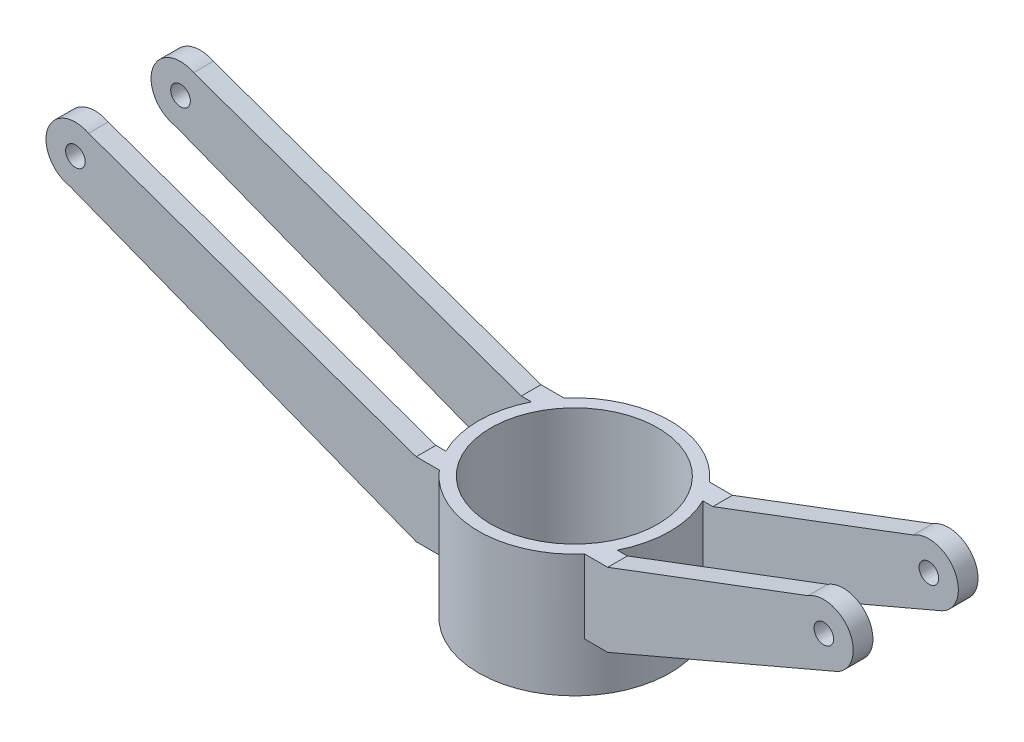
ISO-10303-21;
HEADER;
FILE_DESCRIPTION(('STEP AP214'),'2;1');
FILE_NAME('part.step','',(''),(''),'','','');
FILE_SCHEMA(('AUTOMOTIVE_DESIGN { 1 0 10303 214 1 1 1 1 }'));
ENDSEC;
DATA;
#1=APPLICATION_CONTEXT('core data for automotive mechanical design processes');
#2=APPLICATION_PROTOCOL_DEFINITION('international standard','automotive_design',2000,#1);
#3=PRODUCT_CONTEXT('',#1,'mechanical');
#4=PRODUCT('Part','Part','',(#3));
#5=PRODUCT_RELATED_PRODUCT_CATEGORY('part','',(#4));
#6=PRODUCT_DEFINITION_FORMATION('','',#4);
#7=PRODUCT_DEFINITION_CONTEXT('part definition',#1,'design');
#8=PRODUCT_DEFINITION('design','',#6,#7);
#9=PRODUCT_DEFINITION_SHAPE('','',#8);
#10=(LENGTH_UNIT() NAMED_UNIT(*) SI_UNIT(.MILLI.,.METRE.));
#11=(NAMED_UNIT(*) PLANE_ANGLE_UNIT() SI_UNIT($,.RADIAN.));
#12=(NAMED_UNIT(*) SI_UNIT($,.STERADIAN.) SOLID_ANGLE_UNIT());
#13=UNCERTAINTY_MEASURE_WITH_UNIT(LENGTH_MEASURE(1.E-05),#10,'distance_accuracy_value','');
#14=(GEOMETRIC_REPRESENTATION_CONTEXT(3) GLOBAL_UNCERTAINTY_ASSIGNED_CONTEXT((#13)) GLOBAL_UNIT_ASSIGNED_CONTEXT((#10,
#11,#12)) REPRESENTATION_CONTEXT('',''));
#15=CARTESIAN_POINT('',(0.,0.,0.));
#16=DIRECTION('',(0.,0.,1.));
#17=DIRECTION('',(1.,0.,0.));
#18=AXIS2_PLACEMENT_3D('',#15,#16,#17);
#19=CARTESIAN_POINT('',(0.,50.,0.));
#20=DIRECTION('',(0.,1.,0.));
#21=DIRECTION('',(0.,0.,1.));
#22=AXIS2_PLACEMENT_3D('',#19,#20,#21);
#23=PLANE('',#22);
#24=CARTESIAN_POINT('',(0.,50.,0.));
#25=DIRECTION('',(0.,1.,0.));
#26=DIRECTION('',(0.,0.,1.));
#27=AXIS2_PLACEMENT_3D('',#24,#25,#26);
#28=CIRCLE('',#27,39.);
#29=CARTESIAN_POINT('',(29.5945941009503,50.,-25.4));
#30=VERTEX_POINT('',#29);
#31=CARTESIAN_POINT('',(-29.5945941009503,50.,-25.4));
#32=VERTEX_POINT('',#31);
#33=EDGE_CURVE('E11',#30,#32,#28,.T.);
#34=ORIENTED_EDGE('',*,*,#33,.T.);
#35=DIRECTION('',(-1.,0.,0.));
#36=VECTOR('',#35,1.);
#37=CARTESIAN_POINT('',(-39.,50.,-25.4));
#38=LINE('',#37,#36);
#39=CARTESIAN_POINT('',(-39.,50.,-25.4));
#40=VERTEX_POINT('',#39);
#41=EDGE_CURVE('E353',#32,#40,#38,.T.);
#42=ORIENTED_EDGE('',*,*,#41,.T.);
#43=DIRECTION('',(0.,0.,1.));
#44=VECTOR('',#43,1.);
#45=CARTESIAN_POINT('',(-39.,50.,-17.4));
#46=LINE('',#45,#44);
#47=CARTESIAN_POINT('',(-39.,50.,-17.4));
#48=VERTEX_POINT('',#47);
#49=EDGE_CURVE('E350',#40,#48,#46,.T.);
#50=ORIENTED_EDGE('',*,*,#49,.T.);
#51=DIRECTION('',(1.,0.,0.));
#52=VECTOR('',#51,1.);
#53=CARTESIAN_POINT('',(-39.,50.,-17.4));
#54=LINE('',#53,#52);
#55=CARTESIAN_POINT('',(-34.9032949733976,50.,-17.4));
#56=VERTEX_POINT('',#55);
#57=EDGE_CURVE('E348',#48,#56,#54,.T.);
#58=ORIENTED_EDGE('',*,*,#57,.T.);
#59=CARTESIAN_POINT('',(-34.9032949733976,50.,17.4));
#60=VERTEX_POINT('',#59);
#61=EDGE_CURVE('E49',#56,#60,#28,.T.);
#62=ORIENTED_EDGE('',*,*,#61,.T.);
#63=DIRECTION('',(-1.,0.,0.));
#64=VECTOR('',#63,1.);
#65=CARTESIAN_POINT('',(-39.,50.,17.4));
#66=LINE('',#65,#64);
#67=CARTESIAN_POINT('',(-39.,50.,17.4));
#68=VERTEX_POINT('',#67);
#69=EDGE_CURVE('E301',#60,#68,#66,.T.);
#70=ORIENTED_EDGE('',*,*,#69,.T.);
#71=DIRECTION('',(0.,0.,1.));
#72=VECTOR('',#71,1.);
#73=CARTESIAN_POINT('',(-39.,50.,25.4));
#74=LINE('',#73,#72);
#75=CARTESIAN_POINT('',(-39.,50.,25.4));
#76=VERTEX_POINT('',#75);
#77=EDGE_CURVE('E298',#68,#76,#74,.T.);
#78=ORIENTED_EDGE('',*,*,#77,.T.);
#79=DIRECTION('',(1.,0.,0.));
#80=VECTOR('',#79,1.);
#81=CARTESIAN_POINT('',(-39.,50.,25.4));
#82=LINE('',#81,#80);
#83=CARTESIAN_POINT('',(-29.5945941009503,50.,25.4));
#84=VERTEX_POINT('',#83);
#85=EDGE_CURVE('E64',#76,#84,#82,.T.);
#86=ORIENTED_EDGE('',*,*,#85,.T.);
#87=CARTESIAN_POINT('',(29.5945941009503,50.,25.4));
#88=VERTEX_POINT('',#87);
#89=EDGE_CURVE('E474',#84,#88,#28,.T.);
#90=ORIENTED_EDGE('',*,*,#89,.T.);
#91=DIRECTION('',(1.,0.,0.));
#92=VECTOR('',#91,1.);
#93=CARTESIAN_POINT('',(39.,50.,25.4));
#94=LINE('',#93,#92);
#95=CARTESIAN_POINT('',(39.,50.,25.4));
#96=VERTEX_POINT('',#95);
#97=EDGE_CURVE('E253',#88,#96,#94,.T.);
#98=ORIENTED_EDGE('',*,*,#97,.T.);
#99=DIRECTION('',(0.,0.,-1.));
#100=VECTOR('',#99,1.);
#101=CARTESIAN_POINT('',(39.,50.,17.4));
#102=LINE('',#101,#100);
#103=CARTESIAN_POINT('',(39.,50.,17.4));
#104=VERTEX_POINT('',#103);
#105=EDGE_CURVE('E219',#96,#104,#102,.T.);
#106=ORIENTED_EDGE('',*,*,#105,.T.);
#107=DIRECTION('',(-1.,0.,0.));
#108=VECTOR('',#107,1.);
#109=CARTESIAN_POINT('',(39.,50.,17.4));
#110=LINE('',#109,#108);
#111=CARTESIAN_POINT('',(34.9032949733976,50.,17.4));
#112=VERTEX_POINT('',#111);
#113=EDGE_CURVE('E57',#104,#112,#110,.T.);
#114=ORIENTED_EDGE('',*,*,#113,.T.);
#115=CARTESIAN_POINT('',(34.9032949733976,50.,-17.4));
#116=VERTEX_POINT('',#115);
#117=EDGE_CURVE('E50',#112,#116,#28,.T.);
#118=ORIENTED_EDGE('',*,*,#117,.T.);
#119=DIRECTION('',(1.,0.,0.));
#120=VECTOR('',#119,1.);
#121=CARTESIAN_POINT('',(39.,50.,-17.4));
#122=LINE('',#121,#120);
#123=CARTESIAN_POINT('',(39.,50.,-17.4));
#124=VERTEX_POINT('',#123);
#125=EDGE_CURVE('E406',#116,#124,#122,.T.);
#126=ORIENTED_EDGE('',*,*,#125,.T.);
#127=DIRECTION('',(0.,0.,-1.));
#128=VECTOR('',#127,1.);
#129=CARTESIAN_POINT('',(39.,50.,-25.4));
#130=LINE('',#129,#128);
#131=CARTESIAN_POINT('',(39.,50.,-25.4));
#132=VERTEX_POINT('',#131);
#133=EDGE_CURVE('E396',#124,#132,#130,.T.);
#134=ORIENTED_EDGE('',*,*,#133,.T.);
#135=DIRECTION('',(-1.,0.,0.));
#136=VECTOR('',#135,1.);
#137=CARTESIAN_POINT('',(39.,50.,-25.4));
#138=LINE('',#137,#136);
#139=EDGE_CURVE('E391',#132,#30,#138,.T.);
#140=ORIENTED_EDGE('',*,*,#139,.T.);
#141=EDGE_LOOP('',(#34,#42,#50,#58,#62,#70,#78,#86,#90,#98,#106,#114,#118,#126,#134,#140));
#142=FACE_BOUND('',#141,.T.);
#143=CARTESIAN_POINT('',(0.,50.,0.));
#144=DIRECTION('',(0.,1.,0.));
#145=DIRECTION('',(0.,0.,1.));
#146=AXIS2_PLACEMENT_3D('',#143,#144,#145);
#147=CIRCLE('',#146,34.);
#148=CARTESIAN_POINT('',(0.,50.,34.));
#149=VERTEX_POINT('',#148);
#150=EDGE_CURVE('E416',#149,#149,#147,.T.);
#151=ORIENTED_EDGE('',*,*,#150,.F.);
#152=EDGE_LOOP('',(#151));
#153=FACE_BOUND('',#152,.T.);
#154=ADVANCED_FACE('F40',(#142,#153),#23,.T.);
#155=CARTESIAN_POINT('',(0.,0.,0.));
#156=DIRECTION('',(0.,1.,0.));
#157=DIRECTION('',(0.,0.,1.));
#158=AXIS2_PLACEMENT_3D('',#155,#156,#157);
#159=PLANE('',#158);
#160=CARTESIAN_POINT('',(0.,0.,0.));
#161=DIRECTION('',(0.,1.,0.));
#162=DIRECTION('',(0.,0.,1.));
#163=AXIS2_PLACEMENT_3D('',#160,#161,#162);
#164=CIRCLE('',#163,39.);
#165=CARTESIAN_POINT('',(0.,0.,39.));
#166=VERTEX_POINT('',#165);
#167=EDGE_CURVE('E44',#166,#166,#164,.T.);
#168=ORIENTED_EDGE('',*,*,#167,.F.);
#169=EDGE_LOOP('',(#168));
#170=FACE_BOUND('',#169,.T.);
#171=CARTESIAN_POINT('',(0.,0.,0.));
#172=DIRECTION('',(0.,1.,0.));
#173=DIRECTION('',(0.,0.,1.));
#174=AXIS2_PLACEMENT_3D('',#171,#172,#173);
#175=CIRCLE('',#174,34.);
#176=CARTESIAN_POINT('',(0.,0.,34.));
#177=VERTEX_POINT('',#176);
#178=EDGE_CURVE('E413',#177,#177,#175,.T.);
#179=ORIENTED_EDGE('',*,*,#178,.T.);
#180=EDGE_LOOP('',(#179));
#181=FACE_BOUND('',#180,.T.);
#182=ADVANCED_FACE('F422',(#170,#181),#159,.F.);
#183=CARTESIAN_POINT('',(0.,50.,0.));
#184=DIRECTION('',(0.,-1.,0.));
#185=DIRECTION('',(0.,0.,-1.));
#186=AXIS2_PLACEMENT_3D('',#183,#184,#185);
#187=CYLINDRICAL_SURFACE('',#186,39.);
#188=CARTESIAN_POINT('',(0.,20.,0.));
#189=DIRECTION('',(0.,-1.,0.));
#190=DIRECTION('',(0.,0.,1.));
#191=AXIS2_PLACEMENT_3D('',#188,#189,#190);
#192=CIRCLE('',#191,39.);
#193=CARTESIAN_POINT('',(34.9032949733976,20.,17.4));
#194=VERTEX_POINT('',#193);
#195=CARTESIAN_POINT('',(29.5945941009503,20.,25.4));
#196=VERTEX_POINT('',#195);
#197=EDGE_CURVE('E247',#194,#196,#192,.T.);
#198=ORIENTED_EDGE('',*,*,#197,.T.);
#199=DIRECTION('',(0.,1.,0.));
#200=VECTOR('',#199,1.);
#201=CARTESIAN_POINT('',(29.5945941009503,20.,25.4));
#202=LINE('',#201,#200);
#203=EDGE_CURVE('E242',#196,#88,#202,.T.);
#204=ORIENTED_EDGE('',*,*,#203,.T.);
#205=ORIENTED_EDGE('',*,*,#89,.F.);
#206=DIRECTION('',(0.,1.,0.));
#207=VECTOR('',#206,1.);
#208=CARTESIAN_POINT('',(-29.5945941009503,20.,25.4));
#209=LINE('',#208,#207);
#210=CARTESIAN_POINT('',(-29.5945941009503,20.,25.4));
#211=VERTEX_POINT('',#210);
#212=EDGE_CURVE('E290',#211,#84,#209,.T.);
#213=ORIENTED_EDGE('',*,*,#212,.F.);
#214=CARTESIAN_POINT('',(0.,20.,0.));
#215=DIRECTION('',(0.,-1.,0.));
#216=DIRECTION('',(0.,0.,1.));
#217=AXIS2_PLACEMENT_3D('',#214,#215,#216);
#218=CIRCLE('',#217,39.);
#219=CARTESIAN_POINT('',(-34.9032949733976,20.,17.4));
#220=VERTEX_POINT('',#219);
#221=EDGE_CURVE('E299',#211,#220,#218,.T.);
#222=ORIENTED_EDGE('',*,*,#221,.T.);
#223=DIRECTION('',(0.,1.,0.));
#224=VECTOR('',#223,1.);
#225=CARTESIAN_POINT('',(-34.9032949733976,20.,17.4));
#226=LINE('',#225,#224);
#227=EDGE_CURVE('E292',#220,#60,#226,.T.);
#228=ORIENTED_EDGE('',*,*,#227,.T.);
#229=ORIENTED_EDGE('',*,*,#61,.F.);
#230=DIRECTION('',(0.,1.,0.));
#231=VECTOR('',#230,1.);
#232=CARTESIAN_POINT('',(-34.9032949733976,20.,-17.4));
#233=LINE('',#232,#231);
#234=CARTESIAN_POINT('',(-34.9032949733976,20.,-17.4));
#235=VERTEX_POINT('',#234);
#236=EDGE_CURVE('E339',#235,#56,#233,.T.);
#237=ORIENTED_EDGE('',*,*,#236,.F.);
#238=CARTESIAN_POINT('',(0.,20.,0.));
#239=DIRECTION('',(0.,-1.,0.));
#240=DIRECTION('',(0.,0.,1.));
#241=AXIS2_PLACEMENT_3D('',#238,#239,#240);
#242=CIRCLE('',#241,39.);
#243=CARTESIAN_POINT('',(-29.5945941009503,20.,-25.4));
#244=VERTEX_POINT('',#243);
#245=EDGE_CURVE('E351',#235,#244,#242,.T.);
#246=ORIENTED_EDGE('',*,*,#245,.T.);
#247=DIRECTION('',(0.,1.,0.));
#248=VECTOR('',#247,1.);
#249=CARTESIAN_POINT('',(-29.5945941009503,20.,-25.4));
#250=LINE('',#249,#248);
#251=EDGE_CURVE('E342',#244,#32,#250,.T.);
#252=ORIENTED_EDGE('',*,*,#251,.T.);
#253=ORIENTED_EDGE('',*,*,#33,.F.);
#254=DIRECTION('',(0.,1.,0.));
#255=VECTOR('',#254,1.);
#256=CARTESIAN_POINT('',(29.5945941009503,20.,-25.4));
#257=LINE('',#256,#255);
#258=CARTESIAN_POINT('',(29.5945941009503,20.,-25.4));
#259=VERTEX_POINT('',#258);
#260=EDGE_CURVE('E404',#259,#30,#257,.T.);
#261=ORIENTED_EDGE('',*,*,#260,.F.);
#262=CARTESIAN_POINT('',(0.,20.,0.));
#263=DIRECTION('',(0.,-1.,0.));
#264=DIRECTION('',(0.,0.,1.));
#265=AXIS2_PLACEMENT_3D('',#262,#263,#264);
#266=CIRCLE('',#265,39.);
#267=CARTESIAN_POINT('',(34.9032949733976,20.,-17.4));
#268=VERTEX_POINT('',#267);
#269=EDGE_CURVE('E395',#259,#268,#266,.T.);
#270=ORIENTED_EDGE('',*,*,#269,.T.);
#271=DIRECTION('',(0.,1.,0.));
#272=VECTOR('',#271,1.);
#273=CARTESIAN_POINT('',(34.9032949733976,20.,-17.4));
#274=LINE('',#273,#272);
#275=EDGE_CURVE('E410',#268,#116,#274,.T.);
#276=ORIENTED_EDGE('',*,*,#275,.T.);
#277=ORIENTED_EDGE('',*,*,#117,.F.);
#278=DIRECTION('',(0.,1.,0.));
#279=VECTOR('',#278,1.);
#280=CARTESIAN_POINT('',(34.9032949733976,20.,17.4));
#281=LINE('',#280,#279);
#282=EDGE_CURVE('E245',#194,#112,#281,.T.);
#283=ORIENTED_EDGE('',*,*,#282,.F.);
#284=EDGE_LOOP('',(#198,#204,#205,#213,#222,#228,#229,#237,#246,#252,#253,#261,#270,#276,#277,#283));
#285=FACE_BOUND('',#284,.T.);
#286=ORIENTED_EDGE('',*,*,#167,.T.);
#287=EDGE_LOOP('',(#286));
#288=FACE_BOUND('',#287,.T.);
#289=ADVANCED_FACE('F42',(#285,#288),#187,.T.);
#290=CARTESIAN_POINT('',(0.,50.,0.));
#291=DIRECTION('',(0.,-1.,0.));
#292=DIRECTION('',(0.,0.,-1.));
#293=AXIS2_PLACEMENT_3D('',#290,#291,#292);
#294=CYLINDRICAL_SURFACE('',#293,34.);
#295=ORIENTED_EDGE('',*,*,#150,.T.);
#296=EDGE_LOOP('',(#295));
#297=FACE_BOUND('',#296,.T.);
#298=ORIENTED_EDGE('',*,*,#178,.F.);
#299=EDGE_LOOP('',(#298));
#300=FACE_BOUND('',#299,.T.);
#301=ADVANCED_FACE('F424',(#297,#300),#294,.F.);
#302=CARTESIAN_POINT('',(39.,20.,-25.4));
#303=DIRECTION('',(0.,0.,-1.));
#304=DIRECTION('',(-1.,0.,0.));
#305=AXIS2_PLACEMENT_3D('',#302,#303,#304);
#306=PLANE('',#305);
#307=ORIENTED_EDGE('',*,*,#139,.F.);
#308=DIRECTION('',(-0.935631010056712,-0.35297962125349,0.));
#309=VECTOR('',#308,1.);
#310=CARTESIAN_POINT('',(39.,50.,-25.4));
#311=LINE('',#310,#309);
#312=CARTESIAN_POINT('',(120.557867662406,80.7688233163344,-25.4));
#313=VERTEX_POINT('',#312);
#314=EDGE_CURVE('E375',#313,#132,#311,.T.);
#315=ORIENTED_EDGE('',*,*,#314,.F.);
#316=CARTESIAN_POINT('',(126.995765190073,70.6419543321288,-25.4));
#317=DIRECTION('',(0.,0.,1.));
#318=DIRECTION('',(1.,0.,0.));
#319=AXIS2_PLACEMENT_3D('',#316,#317,#318);
#320=CIRCLE('',#319,12.);
#321=CARTESIAN_POINT('',(130.917867667284,59.3010058639336,-25.4));
#322=VERTEX_POINT('',#321);
#323=EDGE_CURVE('E382',#322,#313,#320,.T.);
#324=ORIENTED_EDGE('',*,*,#323,.F.);
#325=DIRECTION('',(0.91947923650961,0.393138567972802,0.));
#326=VECTOR('',#325,1.);
#327=CARTESIAN_POINT('',(130.917867667284,59.3010058639336,-25.4));
#328=LINE('',#327,#326);
#329=CARTESIAN_POINT('',(39.,20.,-25.4));
#330=VERTEX_POINT('',#329);
#331=EDGE_CURVE('E369',#330,#322,#328,.T.);
#332=ORIENTED_EDGE('',*,*,#331,.F.);
#333=DIRECTION('',(-1.,0.,0.));
#334=VECTOR('',#333,1.);
#335=CARTESIAN_POINT('',(39.,20.,-25.4));
#336=LINE('',#335,#334);
#337=EDGE_CURVE('E392',#330,#259,#336,.T.);
#338=ORIENTED_EDGE('',*,*,#337,.T.);
#339=ORIENTED_EDGE('',*,*,#260,.T.);
#340=EDGE_LOOP('',(#307,#315,#324,#332,#338,#339));
#341=FACE_BOUND('',#340,.T.);
#342=CARTESIAN_POINT('',(126.995765190073,70.6419543321288,-25.4));
#343=DIRECTION('',(0.,0.,1.));
#344=DIRECTION('',(1.,0.,0.));
#345=AXIS2_PLACEMENT_3D('',#342,#343,#344);
#346=CIRCLE('',#345,3.99999999999999);
#347=CARTESIAN_POINT('',(130.995765190073,70.6419543321288,-25.4));
#348=VERTEX_POINT('',#347);
#349=EDGE_CURVE('E355',#348,#348,#346,.T.);
#350=ORIENTED_EDGE('',*,*,#349,.T.);
#351=EDGE_LOOP('',(#350));
#352=FACE_BOUND('',#351,.T.);
#353=ADVANCED_FACE('F426',(#341,#352),#306,.T.);
#354=CARTESIAN_POINT('',(39.,20.,-17.4));
#355=DIRECTION('',(0.,0.,1.));
#356=DIRECTION('',(1.,0.,0.));
#357=AXIS2_PLACEMENT_3D('',#354,#355,#356);
#358=PLANE('',#357);
#359=ORIENTED_EDGE('',*,*,#125,.F.);
#360=ORIENTED_EDGE('',*,*,#275,.F.);
#361=DIRECTION('',(1.,0.,0.));
#362=VECTOR('',#361,1.);
#363=CARTESIAN_POINT('',(39.,20.,-17.4));
#364=LINE('',#363,#362);
#365=CARTESIAN_POINT('',(39.,20.,-17.4));
#366=VERTEX_POINT('',#365);
#367=EDGE_CURVE('E399',#268,#366,#364,.T.);
#368=ORIENTED_EDGE('',*,*,#367,.T.);
#369=DIRECTION('',(0.91947923650961,0.393138567972802,0.));
#370=VECTOR('',#369,1.);
#371=CARTESIAN_POINT('',(130.917867667284,59.3010058639336,-17.4));
#372=LINE('',#371,#370);
#373=CARTESIAN_POINT('',(130.917867667284,59.3010058639336,-17.4));
#374=VERTEX_POINT('',#373);
#375=EDGE_CURVE('E372',#366,#374,#372,.T.);
#376=ORIENTED_EDGE('',*,*,#375,.T.);
#377=CARTESIAN_POINT('',(126.995765190073,70.6419543321288,-17.4));
#378=DIRECTION('',(0.,0.,1.));
#379=DIRECTION('',(1.,0.,0.));
#380=AXIS2_PLACEMENT_3D('',#377,#378,#379);
#381=CIRCLE('',#380,12.);
#382=CARTESIAN_POINT('',(120.557867662406,80.7688233163344,-17.4));
#383=VERTEX_POINT('',#382);
#384=EDGE_CURVE('E374',#374,#383,#381,.T.);
#385=ORIENTED_EDGE('',*,*,#384,.T.);
#386=DIRECTION('',(-0.935631010056712,-0.35297962125349,0.));
#387=VECTOR('',#386,1.);
#388=CARTESIAN_POINT('',(39.,50.,-17.4));
#389=LINE('',#388,#387);
#390=EDGE_CURVE('E377',#383,#124,#389,.T.);
#391=ORIENTED_EDGE('',*,*,#390,.T.);
#392=EDGE_LOOP('',(#359,#360,#368,#376,#385,#391));
#393=FACE_BOUND('',#392,.T.);
#394=CARTESIAN_POINT('',(126.995765190073,70.6419543321288,-17.4));
#395=DIRECTION('',(0.,0.,1.));
#396=DIRECTION('',(1.,0.,0.));
#397=AXIS2_PLACEMENT_3D('',#394,#395,#396);
#398=CIRCLE('',#397,3.99999999999999);
#399=CARTESIAN_POINT('',(130.995765190073,70.6419543321288,-17.4));
#400=VERTEX_POINT('',#399);
#401=EDGE_CURVE('E366',#400,#400,#398,.T.);
#402=ORIENTED_EDGE('',*,*,#401,.F.);
#403=EDGE_LOOP('',(#402));
#404=FACE_BOUND('',#403,.T.);
#405=ADVANCED_FACE('F433',(#393,#404),#358,.T.);
#406=CARTESIAN_POINT('',(0.,20.,0.));
#407=DIRECTION('',(0.,1.,0.));
#408=DIRECTION('',(0.,0.,1.));
#409=AXIS2_PLACEMENT_3D('',#406,#407,#408);
#410=PLANE('',#409);
#411=ORIENTED_EDGE('',*,*,#337,.F.);
#412=DIRECTION('',(0.,0.,-1.));
#413=VECTOR('',#412,1.);
#414=CARTESIAN_POINT('',(39.,20.,-25.4));
#415=LINE('',#414,#413);
#416=EDGE_CURVE('E401',#366,#330,#415,.T.);
#417=ORIENTED_EDGE('',*,*,#416,.F.);
#418=ORIENTED_EDGE('',*,*,#367,.F.);
#419=ORIENTED_EDGE('',*,*,#269,.F.);
#420=EDGE_LOOP('',(#411,#417,#418,#419));
#421=FACE_BOUND('',#420,.T.);
#422=ADVANCED_FACE('F487',(#421),#410,.F.);
#423=CARTESIAN_POINT('',(130.917867667284,59.3010058639336,-17.4));
#424=DIRECTION('',(-0.393138567972802,0.919479236509609,0.));
#425=DIRECTION('',(-0.91947923650961,-0.393138567972802,0.));
#426=AXIS2_PLACEMENT_3D('',#423,#424,#425);
#427=PLANE('',#426);
#428=ORIENTED_EDGE('',*,*,#331,.T.);
#429=DIRECTION('',(0.,0.,-1.));
#430=VECTOR('',#429,1.);
#431=CARTESIAN_POINT('',(130.917867667284,59.3010058639336,-17.4));
#432=LINE('',#431,#430);
#433=EDGE_CURVE('E388',#374,#322,#432,.T.);
#434=ORIENTED_EDGE('',*,*,#433,.F.);
#435=ORIENTED_EDGE('',*,*,#375,.F.);
#436=ORIENTED_EDGE('',*,*,#416,.T.);
#437=EDGE_LOOP('',(#428,#434,#435,#436));
#438=FACE_BOUND('',#437,.T.);
#439=ADVANCED_FACE('F496',(#438),#427,.F.);
#440=CARTESIAN_POINT('',(126.995765190073,70.6419543321288,-17.4));
#441=DIRECTION('',(0.,0.,-1.));
#442=DIRECTION('',(-1.,0.,0.));
#443=AXIS2_PLACEMENT_3D('',#440,#441,#442);
#444=CYLINDRICAL_SURFACE('',#443,12.);
#445=ORIENTED_EDGE('',*,*,#323,.T.);
#446=DIRECTION('',(0.,0.,-1.));
#447=VECTOR('',#446,1.);
#448=CARTESIAN_POINT('',(120.557867662406,80.7688233163344,-17.4));
#449=LINE('',#448,#447);
#450=EDGE_CURVE('E380',#383,#313,#449,.T.);
#451=ORIENTED_EDGE('',*,*,#450,.F.);
#452=ORIENTED_EDGE('',*,*,#384,.F.);
#453=ORIENTED_EDGE('',*,*,#433,.T.);
#454=EDGE_LOOP('',(#445,#451,#452,#453));
#455=FACE_BOUND('',#454,.T.);
#456=ADVANCED_FACE('F500',(#455),#444,.T.);
#457=CARTESIAN_POINT('',(39.,50.,-17.4));
#458=DIRECTION('',(0.35297962125349,-0.935631010056712,0.));
#459=DIRECTION('',(0.935631010056712,0.35297962125349,0.));
#460=AXIS2_PLACEMENT_3D('',#457,#458,#459);
#461=PLANE('',#460);
#462=ORIENTED_EDGE('',*,*,#314,.T.);
#463=ORIENTED_EDGE('',*,*,#133,.F.);
#464=ORIENTED_EDGE('',*,*,#390,.F.);
#465=ORIENTED_EDGE('',*,*,#450,.T.);
#466=EDGE_LOOP('',(#462,#463,#464,#465));
#467=FACE_BOUND('',#466,.T.);
#468=ADVANCED_FACE('F502',(#467),#461,.F.);
#469=CARTESIAN_POINT('',(126.995765190073,70.6419543321288,-17.4));
#470=DIRECTION('',(0.,0.,-1.));
#471=DIRECTION('',(-1.,0.,0.));
#472=AXIS2_PLACEMENT_3D('',#469,#470,#471);
#473=CYLINDRICAL_SURFACE('',#472,3.99999999999999);
#474=ORIENTED_EDGE('',*,*,#401,.T.);
#475=EDGE_LOOP('',(#474));
#476=FACE_BOUND('',#475,.T.);
#477=ORIENTED_EDGE('',*,*,#349,.F.);
#478=EDGE_LOOP('',(#477));
#479=FACE_BOUND('',#478,.T.);
#480=ADVANCED_FACE('F504',(#476,#479),#473,.F.);
#481=CARTESIAN_POINT('',(-39.,20.,-17.4));
#482=DIRECTION('',(0.,0.,1.));
#483=DIRECTION('',(1.,0.,0.));
#484=AXIS2_PLACEMENT_3D('',#481,#482,#483);
#485=PLANE('',#484);
#486=ORIENTED_EDGE('',*,*,#57,.F.);
#487=DIRECTION('',(-0.942415275904078,0.334444984627728,0.));
#488=VECTOR('',#487,1.);
#489=CARTESIAN_POINT('',(-172.430922253217,97.3520579333043,-17.4));
#490=LINE('',#489,#488);
#491=CARTESIAN_POINT('',(-172.430922253217,97.3520579333043,-17.4));
#492=VERTEX_POINT('',#491);
#493=EDGE_CURVE('E319',#48,#492,#490,.T.);
#494=ORIENTED_EDGE('',*,*,#493,.T.);
#495=CARTESIAN_POINT('',(-177.792717003959,86.616548767414,-17.4));
#496=DIRECTION('',(0.,0.,1.));
#497=DIRECTION('',(1.,0.,0.));
#498=AXIS2_PLACEMENT_3D('',#495,#496,#497);
#499=CIRCLE('',#498,12.);
#500=CARTESIAN_POINT('',(-179.991273047328,74.8196698867876,-17.4));
#501=VERTEX_POINT('',#500);
#502=EDGE_CURVE('E323',#492,#501,#499,.T.);
#503=ORIENTED_EDGE('',*,*,#502,.T.);
#504=DIRECTION('',(0.932027602266505,-0.36238729091036,0.));
#505=VECTOR('',#504,1.);
#506=CARTESIAN_POINT('',(-39.,20.,-17.4));
#507=LINE('',#506,#505);
#508=CARTESIAN_POINT('',(-39.,20.,-17.4));
#509=VERTEX_POINT('',#508);
#510=EDGE_CURVE('E331',#501,#509,#507,.T.);
#511=ORIENTED_EDGE('',*,*,#510,.T.);
#512=DIRECTION('',(1.,0.,0.));
#513=VECTOR('',#512,1.);
#514=CARTESIAN_POINT('',(-39.,20.,-17.4));
#515=LINE('',#514,#513);
#516=EDGE_CURVE('E345',#509,#235,#515,.T.);
#517=ORIENTED_EDGE('',*,*,#516,.T.);
#518=ORIENTED_EDGE('',*,*,#236,.T.);
#519=EDGE_LOOP('',(#486,#494,#503,#511,#517,#518));
#520=FACE_BOUND('',#519,.T.);
#521=CARTESIAN_POINT('',(-177.792717003959,86.616548767414,-17.4));
#522=DIRECTION('',(0.,0.,1.));
#523=DIRECTION('',(1.,0.,0.));
#524=AXIS2_PLACEMENT_3D('',#521,#522,#523);
#525=CIRCLE('',#524,3.99999999999999);
#526=CARTESIAN_POINT('',(-173.792717003959,86.616548767414,-17.4));
#527=VERTEX_POINT('',#526);
#528=EDGE_CURVE('E329',#527,#527,#525,.T.);
#529=ORIENTED_EDGE('',*,*,#528,.F.);
#530=EDGE_LOOP('',(#529));
#531=FACE_BOUND('',#530,.T.);
#532=ADVANCED_FACE('F471',(#520,#531),#485,.T.);
#533=CARTESIAN_POINT('',(-39.,20.,-25.4));
#534=DIRECTION('',(0.,0.,-1.));
#535=DIRECTION('',(-1.,0.,0.));
#536=AXIS2_PLACEMENT_3D('',#533,#534,#535);
#537=PLANE('',#536);
#538=ORIENTED_EDGE('',*,*,#41,.F.);
#539=ORIENTED_EDGE('',*,*,#251,.F.);
#540=DIRECTION('',(-1.,0.,0.));
#541=VECTOR('',#540,1.);
#542=CARTESIAN_POINT('',(-39.,20.,-25.4));
#543=LINE('',#542,#541);
#544=CARTESIAN_POINT('',(-39.,20.,-25.4));
#545=VERTEX_POINT('',#544);
#546=EDGE_CURVE('E361',#244,#545,#543,.T.);
#547=ORIENTED_EDGE('',*,*,#546,.T.);
#548=DIRECTION('',(0.932027602266505,-0.36238729091036,0.));
#549=VECTOR('',#548,1.);
#550=CARTESIAN_POINT('',(-39.,20.,-25.4));
#551=LINE('',#550,#549);
#552=CARTESIAN_POINT('',(-179.991273047328,74.8196698867876,-25.4));
#553=VERTEX_POINT('',#552);
#554=EDGE_CURVE('E322',#553,#545,#551,.T.);
#555=ORIENTED_EDGE('',*,*,#554,.F.);
#556=CARTESIAN_POINT('',(-177.792717003959,86.616548767414,-25.4));
#557=DIRECTION('',(0.,0.,1.));
#558=DIRECTION('',(1.,0.,0.));
#559=AXIS2_PLACEMENT_3D('',#556,#557,#558);
#560=CIRCLE('',#559,12.);
#561=CARTESIAN_POINT('',(-172.430922253217,97.3520579333043,-25.4));
#562=VERTEX_POINT('',#561);
#563=EDGE_CURVE('E326',#562,#553,#560,.T.);
#564=ORIENTED_EDGE('',*,*,#563,.F.);
#565=DIRECTION('',(-0.942415275904078,0.334444984627728,0.));
#566=VECTOR('',#565,1.);
#567=CARTESIAN_POINT('',(-172.430922253217,97.3520579333043,-25.4));
#568=LINE('',#567,#566);
#569=EDGE_CURVE('E320',#40,#562,#568,.T.);
#570=ORIENTED_EDGE('',*,*,#569,.F.);
#571=EDGE_LOOP('',(#538,#539,#547,#555,#564,#570));
#572=FACE_BOUND('',#571,.T.);
#573=CARTESIAN_POINT('',(-177.792717003959,86.616548767414,-25.4));
#574=DIRECTION('',(0.,0.,1.));
#575=DIRECTION('',(1.,0.,0.));
#576=AXIS2_PLACEMENT_3D('',#573,#574,#575);
#577=CIRCLE('',#576,3.99999999999999);
#578=CARTESIAN_POINT('',(-173.792717003959,86.616548767414,-25.4));
#579=VERTEX_POINT('',#578);
#580=EDGE_CURVE('E336',#579,#579,#577,.T.);
#581=ORIENTED_EDGE('',*,*,#580,.T.);
#582=EDGE_LOOP('',(#581));
#583=FACE_BOUND('',#582,.T.);
#584=ADVANCED_FACE('F452',(#572,#583),#537,.T.);
#585=CARTESIAN_POINT('',(0.,20.,0.));
#586=DIRECTION('',(0.,1.,0.));
#587=DIRECTION('',(0.,0.,1.));
#588=AXIS2_PLACEMENT_3D('',#585,#586,#587);
#589=PLANE('',#588);
#590=ORIENTED_EDGE('',*,*,#245,.F.);
#591=ORIENTED_EDGE('',*,*,#516,.F.);
#592=DIRECTION('',(0.,0.,1.));
#593=VECTOR('',#592,1.);
#594=CARTESIAN_POINT('',(-39.,20.,-17.4));
#595=LINE('',#594,#593);
#596=EDGE_CURVE('E358',#545,#509,#595,.T.);
#597=ORIENTED_EDGE('',*,*,#596,.F.);
#598=ORIENTED_EDGE('',*,*,#546,.F.);
#599=EDGE_LOOP('',(#590,#591,#597,#598));
#600=FACE_BOUND('',#599,.T.);
#601=ADVANCED_FACE('F456',(#600),#589,.F.);
#602=CARTESIAN_POINT('',(-177.792717003959,86.616548767414,-17.4));
#603=DIRECTION('',(0.,0.,-1.));
#604=DIRECTION('',(-1.,0.,0.));
#605=AXIS2_PLACEMENT_3D('',#602,#603,#604);
#606=CYLINDRICAL_SURFACE('',#605,12.);
#607=ORIENTED_EDGE('',*,*,#563,.T.);
#608=DIRECTION('',(0.,0.,-1.));
#609=VECTOR('',#608,1.);
#610=CARTESIAN_POINT('',(-179.991273047328,74.8196698867876,-17.4));
#611=LINE('',#610,#609);
#612=EDGE_CURVE('E303',#501,#553,#611,.T.);
#613=ORIENTED_EDGE('',*,*,#612,.F.);
#614=ORIENTED_EDGE('',*,*,#502,.F.);
#615=DIRECTION('',(0.,0.,-1.));
#616=VECTOR('',#615,1.);
#617=CARTESIAN_POINT('',(-172.430922253217,97.3520579333043,-17.4));
#618=LINE('',#617,#616);
#619=EDGE_CURVE('E316',#492,#562,#618,.T.);
#620=ORIENTED_EDGE('',*,*,#619,.T.);
#621=EDGE_LOOP('',(#607,#613,#614,#620));
#622=FACE_BOUND('',#621,.T.);
#623=ADVANCED_FACE('F462',(#622),#606,.T.);
#624=CARTESIAN_POINT('',(-39.,20.,-17.4));
#625=DIRECTION('',(0.36238729091036,0.932027602266505,0.));
#626=DIRECTION('',(-0.932027602266505,0.36238729091036,0.));
#627=AXIS2_PLACEMENT_3D('',#624,#625,#626);
#628=PLANE('',#627);
#629=ORIENTED_EDGE('',*,*,#554,.T.);
#630=ORIENTED_EDGE('',*,*,#596,.T.);
#631=ORIENTED_EDGE('',*,*,#510,.F.);
#632=ORIENTED_EDGE('',*,*,#612,.T.);
#633=EDGE_LOOP('',(#629,#630,#631,#632));
#634=FACE_BOUND('',#633,.T.);
#635=ADVANCED_FACE('F458',(#634),#628,.F.);
#636=CARTESIAN_POINT('',(-172.430922253217,97.3520579333043,-17.4));
#637=DIRECTION('',(-0.334444984627728,-0.942415275904078,0.));
#638=DIRECTION('',(0.942415275904078,-0.334444984627728,0.));
#639=AXIS2_PLACEMENT_3D('',#636,#637,#638);
#640=PLANE('',#639);
#641=ORIENTED_EDGE('',*,*,#569,.T.);
#642=ORIENTED_EDGE('',*,*,#619,.F.);
#643=ORIENTED_EDGE('',*,*,#493,.F.);
#644=ORIENTED_EDGE('',*,*,#49,.F.);
#645=EDGE_LOOP('',(#641,#642,#643,#644));
#646=FACE_BOUND('',#645,.T.);
#647=ADVANCED_FACE('F467',(#646),#640,.F.);
#648=CARTESIAN_POINT('',(-177.792717003959,86.616548767414,-17.4));
#649=DIRECTION('',(0.,0.,-1.));
#650=DIRECTION('',(-1.,0.,0.));
#651=AXIS2_PLACEMENT_3D('',#648,#649,#650);
#652=CYLINDRICAL_SURFACE('',#651,3.99999999999999);
#653=ORIENTED_EDGE('',*,*,#528,.T.);
#654=EDGE_LOOP('',(#653));
#655=FACE_BOUND('',#654,.T.);
#656=ORIENTED_EDGE('',*,*,#580,.F.);
#657=EDGE_LOOP('',(#656));
#658=FACE_BOUND('',#657,.T.);
#659=ADVANCED_FACE('F600',(#655,#658),#652,.F.);
#660=CARTESIAN_POINT('',(-39.,20.,25.4));
#661=DIRECTION('',(0.,0.,1.));
#662=DIRECTION('',(1.,0.,0.));
#663=AXIS2_PLACEMENT_3D('',#660,#661,#662);
#664=PLANE('',#663);
#665=ORIENTED_EDGE('',*,*,#85,.F.);
#666=DIRECTION('',(-0.942415275904078,0.334444984627728,0.));
#667=VECTOR('',#666,1.);
#668=CARTESIAN_POINT('',(-39.,50.,25.4));
#669=LINE('',#668,#667);
#670=CARTESIAN_POINT('',(-172.430922253217,97.3520579333043,25.4));
#671=VERTEX_POINT('',#670);
#672=EDGE_CURVE('E267',#76,#671,#669,.T.);
#673=ORIENTED_EDGE('',*,*,#672,.T.);
#674=CARTESIAN_POINT('',(-177.792717003959,86.616548767414,25.4));
#675=DIRECTION('',(0.,0.,1.));
#676=DIRECTION('',(1.,0.,0.));
#677=AXIS2_PLACEMENT_3D('',#674,#675,#676);
#678=CIRCLE('',#677,12.);
#679=CARTESIAN_POINT('',(-179.991273047328,74.8196698867876,25.4));
#680=VERTEX_POINT('',#679);
#681=EDGE_CURVE('E283',#671,#680,#678,.T.);
#682=ORIENTED_EDGE('',*,*,#681,.T.);
#683=DIRECTION('',(0.932027602266505,-0.36238729091036,0.));
#684=VECTOR('',#683,1.);
#685=CARTESIAN_POINT('',(-39.,20.,25.4));
#686=LINE('',#685,#684);
#687=CARTESIAN_POINT('',(-39.,20.,25.4));
#688=VERTEX_POINT('',#687);
#689=EDGE_CURVE('E274',#680,#688,#686,.T.);
#690=ORIENTED_EDGE('',*,*,#689,.T.);
#691=DIRECTION('',(1.,0.,0.));
#692=VECTOR('',#691,1.);
#693=CARTESIAN_POINT('',(-39.,20.,25.4));
#694=LINE('',#693,#692);
#695=EDGE_CURVE('E295',#688,#211,#694,.T.);
#696=ORIENTED_EDGE('',*,*,#695,.T.);
#697=ORIENTED_EDGE('',*,*,#212,.T.);
#698=EDGE_LOOP('',(#665,#673,#682,#690,#696,#697));
#699=FACE_BOUND('',#698,.T.);
#700=CARTESIAN_POINT('',(-177.792717003959,86.616548767414,25.4));
#701=DIRECTION('',(0.,0.,1.));
#702=DIRECTION('',(1.,0.,0.));
#703=AXIS2_PLACEMENT_3D('',#700,#701,#702);
#704=CIRCLE('',#703,3.99999999999999);
#705=CARTESIAN_POINT('',(-173.792717003959,86.616548767414,25.4));
#706=VERTEX_POINT('',#705);
#707=EDGE_CURVE('E255',#706,#706,#704,.T.);
#708=ORIENTED_EDGE('',*,*,#707,.F.);
#709=EDGE_LOOP('',(#708));
#710=FACE_BOUND('',#709,.T.);
#711=ADVANCED_FACE('F609',(#699,#710),#664,.T.);
#712=CARTESIAN_POINT('',(-39.,20.,17.4));
#713=DIRECTION('',(0.,0.,-1.));
#714=DIRECTION('',(-1.,0.,0.));
#715=AXIS2_PLACEMENT_3D('',#712,#713,#714);
#716=PLANE('',#715);
#717=ORIENTED_EDGE('',*,*,#69,.F.);
#718=ORIENTED_EDGE('',*,*,#227,.F.);
#719=DIRECTION('',(-1.,0.,0.));
#720=VECTOR('',#719,1.);
#721=CARTESIAN_POINT('',(-39.,20.,17.4));
#722=LINE('',#721,#720);
#723=CARTESIAN_POINT('',(-39.,20.,17.4));
#724=VERTEX_POINT('',#723);
#725=EDGE_CURVE('E309',#220,#724,#722,.T.);
#726=ORIENTED_EDGE('',*,*,#725,.T.);
#727=DIRECTION('',(0.932027602266505,-0.36238729091036,0.));
#728=VECTOR('',#727,1.);
#729=CARTESIAN_POINT('',(-39.,20.,17.4));
#730=LINE('',#729,#728);
#731=CARTESIAN_POINT('',(-179.991273047328,74.8196698867876,17.4));
#732=VERTEX_POINT('',#731);
#733=EDGE_CURVE('E277',#732,#724,#730,.T.);
#734=ORIENTED_EDGE('',*,*,#733,.F.);
#735=CARTESIAN_POINT('',(-177.792717003959,86.616548767414,17.4));
#736=DIRECTION('',(0.,0.,1.));
#737=DIRECTION('',(1.,0.,0.));
#738=AXIS2_PLACEMENT_3D('',#735,#736,#737);
#739=CIRCLE('',#738,12.);
#740=CARTESIAN_POINT('',(-172.430922253217,97.3520579333043,17.4));
#741=VERTEX_POINT('',#740);
#742=EDGE_CURVE('E273',#741,#732,#739,.T.);
#743=ORIENTED_EDGE('',*,*,#742,.F.);
#744=DIRECTION('',(-0.942415275904078,0.334444984627728,0.));
#745=VECTOR('',#744,1.);
#746=CARTESIAN_POINT('',(-39.,50.,17.4));
#747=LINE('',#746,#745);
#748=EDGE_CURVE('E270',#68,#741,#747,.T.);
#749=ORIENTED_EDGE('',*,*,#748,.F.);
#750=EDGE_LOOP('',(#717,#718,#726,#734,#743,#749));
#751=FACE_BOUND('',#750,.T.);
#752=CARTESIAN_POINT('',(-177.792717003959,86.616548767414,17.4));
#753=DIRECTION('',(0.,0.,1.));
#754=DIRECTION('',(1.,0.,0.));
#755=AXIS2_PLACEMENT_3D('',#752,#753,#754);
#756=CIRCLE('',#755,3.99999999999999);
#757=CARTESIAN_POINT('',(-173.792717003959,86.616548767414,17.4));
#758=VERTEX_POINT('',#757);
#759=EDGE_CURVE('E264',#758,#758,#756,.T.);
#760=ORIENTED_EDGE('',*,*,#759,.T.);
#761=EDGE_LOOP('',(#760));
#762=FACE_BOUND('',#761,.T.);
#763=ADVANCED_FACE('F619',(#751,#762),#716,.T.);
#764=CARTESIAN_POINT('',(0.,20.,0.));
#765=DIRECTION('',(0.,1.,0.));
#766=DIRECTION('',(0.,0.,1.));
#767=AXIS2_PLACEMENT_3D('',#764,#765,#766);
#768=PLANE('',#767);
#769=ORIENTED_EDGE('',*,*,#221,.F.);
#770=ORIENTED_EDGE('',*,*,#695,.F.);
#771=DIRECTION('',(0.,0.,1.));
#772=VECTOR('',#771,1.);
#773=CARTESIAN_POINT('',(-39.,20.,25.4));
#774=LINE('',#773,#772);
#775=EDGE_CURVE('E306',#724,#688,#774,.T.);
#776=ORIENTED_EDGE('',*,*,#775,.F.);
#777=ORIENTED_EDGE('',*,*,#725,.F.);
#778=EDGE_LOOP('',(#769,#770,#776,#777));
#779=FACE_BOUND('',#778,.T.);
#780=ADVANCED_FACE('F630',(#779),#768,.F.);
#781=CARTESIAN_POINT('',(-39.,50.,17.4));
#782=DIRECTION('',(0.334444984627728,0.942415275904078,0.));
#783=DIRECTION('',(-0.942415275904078,0.334444984627728,0.));
#784=AXIS2_PLACEMENT_3D('',#781,#782,#783);
#785=PLANE('',#784);
#786=ORIENTED_EDGE('',*,*,#672,.F.);
#787=ORIENTED_EDGE('',*,*,#77,.F.);
#788=ORIENTED_EDGE('',*,*,#748,.T.);
#789=DIRECTION('',(0.,0.,1.));
#790=VECTOR('',#789,1.);
#791=CARTESIAN_POINT('',(-172.430922253217,97.3520579333043,17.4));
#792=LINE('',#791,#790);
#793=EDGE_CURVE('E280',#741,#671,#792,.T.);
#794=ORIENTED_EDGE('',*,*,#793,.T.);
#795=EDGE_LOOP('',(#786,#787,#788,#794));
#796=FACE_BOUND('',#795,.T.);
#797=ADVANCED_FACE('F641',(#796),#785,.T.);
#798=CARTESIAN_POINT('',(-39.,20.,17.4));
#799=DIRECTION('',(-0.36238729091036,-0.932027602266505,0.));
#800=DIRECTION('',(0.932027602266505,-0.36238729091036,0.));
#801=AXIS2_PLACEMENT_3D('',#798,#799,#800);
#802=PLANE('',#801);
#803=ORIENTED_EDGE('',*,*,#689,.F.);
#804=DIRECTION('',(0.,0.,1.));
#805=VECTOR('',#804,1.);
#806=CARTESIAN_POINT('',(-179.991273047328,74.8196698867876,17.4));
#807=LINE('',#806,#805);
#808=EDGE_CURVE('E288',#732,#680,#807,.T.);
#809=ORIENTED_EDGE('',*,*,#808,.F.);
#810=ORIENTED_EDGE('',*,*,#733,.T.);
#811=ORIENTED_EDGE('',*,*,#775,.T.);
#812=EDGE_LOOP('',(#803,#809,#810,#811));
#813=FACE_BOUND('',#812,.T.);
#814=ADVANCED_FACE('F653',(#813),#802,.T.);
#815=CARTESIAN_POINT('',(-177.792717003959,86.616548767414,17.4));
#816=DIRECTION('',(0.,0.,1.));
#817=DIRECTION('',(1.,0.,0.));
#818=AXIS2_PLACEMENT_3D('',#815,#816,#817);
#819=CYLINDRICAL_SURFACE('',#818,12.);
#820=ORIENTED_EDGE('',*,*,#681,.F.);
#821=ORIENTED_EDGE('',*,*,#793,.F.);
#822=ORIENTED_EDGE('',*,*,#742,.T.);
#823=ORIENTED_EDGE('',*,*,#808,.T.);
#824=EDGE_LOOP('',(#820,#821,#822,#823));
#825=FACE_BOUND('',#824,.T.);
#826=ADVANCED_FACE('F664',(#825),#819,.T.);
#827=CARTESIAN_POINT('',(-177.792717003959,86.616548767414,17.4));
#828=DIRECTION('',(0.,0.,1.));
#829=DIRECTION('',(1.,0.,0.));
#830=AXIS2_PLACEMENT_3D('',#827,#828,#829);
#831=CYLINDRICAL_SURFACE('',#830,3.99999999999999);
#832=ORIENTED_EDGE('',*,*,#759,.F.);
#833=EDGE_LOOP('',(#832));
#834=FACE_BOUND('',#833,.T.);
#835=ORIENTED_EDGE('',*,*,#707,.T.);
#836=EDGE_LOOP('',(#835));
#837=FACE_BOUND('',#836,.T.);
#838=ADVANCED_FACE('F674',(#834,#837),#831,.F.);
#839=CARTESIAN_POINT('',(39.,20.,25.4));
#840=DIRECTION('',(0.,0.,1.));
#841=DIRECTION('',(1.,0.,0.));
#842=AXIS2_PLACEMENT_3D('',#839,#840,#841);
#843=PLANE('',#842);
#844=ORIENTED_EDGE('',*,*,#97,.F.);
#845=ORIENTED_EDGE('',*,*,#203,.F.);
#846=DIRECTION('',(1.,0.,0.));
#847=VECTOR('',#846,1.);
#848=CARTESIAN_POINT('',(39.,20.,25.4));
#849=LINE('',#848,#847);
#850=CARTESIAN_POINT('',(39.,20.,25.4));
#851=VERTEX_POINT('',#850);
#852=EDGE_CURVE('E251',#196,#851,#849,.T.);
#853=ORIENTED_EDGE('',*,*,#852,.T.);
#854=DIRECTION('',(0.91947923650961,0.393138567972802,0.));
#855=VECTOR('',#854,1.);
#856=CARTESIAN_POINT('',(39.,20.,25.4));
#857=LINE('',#856,#855);
#858=CARTESIAN_POINT('',(130.917867667284,59.3010058639336,25.4));
#859=VERTEX_POINT('',#858);
#860=EDGE_CURVE('E222',#851,#859,#857,.T.);
#861=ORIENTED_EDGE('',*,*,#860,.T.);
#862=CARTESIAN_POINT('',(126.995765190073,70.6419543321288,25.4));
#863=DIRECTION('',(0.,0.,1.));
#864=DIRECTION('',(1.,0.,0.));
#865=AXIS2_PLACEMENT_3D('',#862,#863,#864);
#866=CIRCLE('',#865,12.);
#867=CARTESIAN_POINT('',(120.557867662406,80.7688233163344,25.4));
#868=VERTEX_POINT('',#867);
#869=EDGE_CURVE('E207',#859,#868,#866,.T.);
#870=ORIENTED_EDGE('',*,*,#869,.T.);
#871=DIRECTION('',(-0.935631010056712,-0.35297962125349,0.));
#872=VECTOR('',#871,1.);
#873=CARTESIAN_POINT('',(39.,50.,25.4));
#874=LINE('',#873,#872);
#875=EDGE_CURVE('E217',#868,#96,#874,.T.);
#876=ORIENTED_EDGE('',*,*,#875,.T.);
#877=EDGE_LOOP('',(#844,#845,#853,#861,#870,#876));
#878=FACE_BOUND('',#877,.T.);
#879=CARTESIAN_POINT('',(126.995765190073,70.6419543321288,25.4));
#880=DIRECTION('',(0.,0.,1.));
#881=DIRECTION('',(1.,0.,0.));
#882=AXIS2_PLACEMENT_3D('',#879,#880,#881);
#883=CIRCLE('',#882,3.99999999999999);
#884=CARTESIAN_POINT('',(130.995765190073,70.6419543321288,25.4));
#885=VERTEX_POINT('',#884);
#886=EDGE_CURVE('E239',#885,#885,#883,.T.);
#887=ORIENTED_EDGE('',*,*,#886,.F.);
#888=EDGE_LOOP('',(#887));
#889=FACE_BOUND('',#888,.T.);
#890=ADVANCED_FACE('F225',(#878,#889),#843,.T.);
#891=CARTESIAN_POINT('',(39.,20.,17.4));
#892=DIRECTION('',(0.,0.,-1.));
#893=DIRECTION('',(-1.,0.,0.));
#894=AXIS2_PLACEMENT_3D('',#891,#892,#893);
#895=PLANE('',#894);
#896=ORIENTED_EDGE('',*,*,#113,.F.);
#897=DIRECTION('',(-0.935631010056712,-0.35297962125349,0.));
#898=VECTOR('',#897,1.);
#899=CARTESIAN_POINT('',(39.,50.,17.4));
#900=LINE('',#899,#898);
#901=CARTESIAN_POINT('',(120.557867662406,80.7688233163344,17.4));
#902=VERTEX_POINT('',#901);
#903=EDGE_CURVE('E229',#902,#104,#900,.T.);
#904=ORIENTED_EDGE('',*,*,#903,.F.);
#905=CARTESIAN_POINT('',(126.995765190073,70.6419543321288,17.4));
#906=DIRECTION('',(0.,0.,1.));
#907=DIRECTION('',(1.,0.,0.));
#908=AXIS2_PLACEMENT_3D('',#905,#906,#907);
#909=CIRCLE('',#908,12.);
#910=CARTESIAN_POINT('',(130.917867667284,59.3010058639336,17.4));
#911=VERTEX_POINT('',#910);
#912=EDGE_CURVE('E209',#911,#902,#909,.T.);
#913=ORIENTED_EDGE('',*,*,#912,.F.);
#914=DIRECTION('',(0.91947923650961,0.393138567972802,0.));
#915=VECTOR('',#914,1.);
#916=CARTESIAN_POINT('',(39.,20.,17.4));
#917=LINE('',#916,#915);
#918=CARTESIAN_POINT('',(39.,20.,17.4));
#919=VERTEX_POINT('',#918);
#920=EDGE_CURVE('E232',#919,#911,#917,.T.);
#921=ORIENTED_EDGE('',*,*,#920,.F.);
#922=DIRECTION('',(-1.,0.,0.));
#923=VECTOR('',#922,1.);
#924=CARTESIAN_POINT('',(39.,20.,17.4));
#925=LINE('',#924,#923);
#926=EDGE_CURVE('E258',#919,#194,#925,.T.);
#927=ORIENTED_EDGE('',*,*,#926,.T.);
#928=ORIENTED_EDGE('',*,*,#282,.T.);
#929=EDGE_LOOP('',(#896,#904,#913,#921,#927,#928));
#930=FACE_BOUND('',#929,.T.);
#931=CARTESIAN_POINT('',(126.995765190073,70.6419543321288,17.4));
#932=DIRECTION('',(0.,0.,1.));
#933=DIRECTION('',(1.,0.,0.));
#934=AXIS2_PLACEMENT_3D('',#931,#932,#933);
#935=CIRCLE('',#934,3.99999999999999);
#936=CARTESIAN_POINT('',(130.995765190073,70.6419543321288,17.4));
#937=VERTEX_POINT('',#936);
#938=EDGE_CURVE('E221',#937,#937,#935,.T.);
#939=ORIENTED_EDGE('',*,*,#938,.T.);
#940=EDGE_LOOP('',(#939));
#941=FACE_BOUND('',#940,.T.);
#942=ADVANCED_FACE('F693',(#930,#941),#895,.T.);
#943=CARTESIAN_POINT('',(0.,20.,0.));
#944=DIRECTION('',(0.,1.,0.));
#945=DIRECTION('',(0.,0.,1.));
#946=AXIS2_PLACEMENT_3D('',#943,#944,#945);
#947=PLANE('',#946);
#948=ORIENTED_EDGE('',*,*,#852,.F.);
#949=ORIENTED_EDGE('',*,*,#197,.F.);
#950=ORIENTED_EDGE('',*,*,#926,.F.);
#951=DIRECTION('',(0.,0.,-1.));
#952=VECTOR('',#951,1.);
#953=CARTESIAN_POINT('',(39.,20.,17.4));
#954=LINE('',#953,#952);
#955=EDGE_CURVE('E260',#851,#919,#954,.T.);
#956=ORIENTED_EDGE('',*,*,#955,.F.);
#957=EDGE_LOOP('',(#948,#949,#950,#956));
#958=FACE_BOUND('',#957,.T.);
#959=ADVANCED_FACE('F703',(#958),#947,.F.);
#960=CARTESIAN_POINT('',(39.,50.,17.4));
#961=DIRECTION('',(-0.35297962125349,0.935631010056712,0.));
#962=DIRECTION('',(-0.935631010056712,-0.35297962125349,0.));
#963=AXIS2_PLACEMENT_3D('',#960,#961,#962);
#964=PLANE('',#963);
#965=ORIENTED_EDGE('',*,*,#875,.F.);
#966=DIRECTION('',(0.,0.,1.));
#967=VECTOR('',#966,1.);
#968=CARTESIAN_POINT('',(120.557867662406,80.7688233163344,17.4));
#969=LINE('',#968,#967);
#970=EDGE_CURVE('E203',#902,#868,#969,.T.);
#971=ORIENTED_EDGE('',*,*,#970,.F.);
#972=ORIENTED_EDGE('',*,*,#903,.T.);
#973=ORIENTED_EDGE('',*,*,#105,.F.);
#974=EDGE_LOOP('',(#965,#971,#972,#973));
#975=FACE_BOUND('',#974,.T.);
#976=ADVANCED_FACE('F218',(#975),#964,.T.);
#977=CARTESIAN_POINT('',(126.995765190073,70.6419543321288,17.4));
#978=DIRECTION('',(0.,0.,1.));
#979=DIRECTION('',(1.,0.,0.));
#980=AXIS2_PLACEMENT_3D('',#977,#978,#979);
#981=CYLINDRICAL_SURFACE('',#980,12.);
#982=ORIENTED_EDGE('',*,*,#869,.F.);
#983=DIRECTION('',(0.,0.,1.));
#984=VECTOR('',#983,1.);
#985=CARTESIAN_POINT('',(130.917867667284,59.3010058639336,17.4));
#986=LINE('',#985,#984);
#987=EDGE_CURVE('E213',#911,#859,#986,.T.);
#988=ORIENTED_EDGE('',*,*,#987,.F.);
#989=ORIENTED_EDGE('',*,*,#912,.T.);
#990=ORIENTED_EDGE('',*,*,#970,.T.);
#991=EDGE_LOOP('',(#982,#988,#989,#990));
#992=FACE_BOUND('',#991,.T.);
#993=ADVANCED_FACE('F205',(#992),#981,.T.);
#994=CARTESIAN_POINT('',(39.,20.,17.4));
#995=DIRECTION('',(0.393138567972802,-0.919479236509609,0.));
#996=DIRECTION('',(0.91947923650961,0.393138567972802,0.));
#997=AXIS2_PLACEMENT_3D('',#994,#995,#996);
#998=PLANE('',#997);
#999=ORIENTED_EDGE('',*,*,#860,.F.);
#1000=ORIENTED_EDGE('',*,*,#955,.T.);
#1001=ORIENTED_EDGE('',*,*,#920,.T.);
#1002=ORIENTED_EDGE('',*,*,#987,.T.);
#1003=EDGE_LOOP('',(#999,#1000,#1001,#1002));
#1004=FACE_BOUND('',#1003,.T.);
#1005=ADVANCED_FACE('F733',(#1004),#998,.T.);
#1006=CARTESIAN_POINT('',(126.995765190073,70.6419543321288,17.4));
#1007=DIRECTION('',(0.,0.,1.));
#1008=DIRECTION('',(1.,0.,0.));
#1009=AXIS2_PLACEMENT_3D('',#1006,#1007,#1008);
#1010=CYLINDRICAL_SURFACE('',#1009,3.99999999999999);
#1011=ORIENTED_EDGE('',*,*,#938,.F.);
#1012=EDGE_LOOP('',(#1011));
#1013=FACE_BOUND('',#1012,.T.);
#1014=ORIENTED_EDGE('',*,*,#886,.T.);
#1015=EDGE_LOOP('',(#1014));
#1016=FACE_BOUND('',#1015,.T.);
#1017=ADVANCED_FACE('F742',(#1013,#1016),#1010,.F.);
#1018=CLOSED_SHELL('',(#154,#182,#289,#301,#353,#405,#422,#439,#456,#468,#480,#532,#584,#601,
#623,#635,#647,#659,#711,#763,#780,#797,#814,#826,#838,#890,#942,#959,#976,#993,#1005,#1017));
#1019=MANIFOLD_SOLID_BREP('B2',#1018);
#1020=ADVANCED_BREP_SHAPE_REPRESENTATION('',(#18,#1019),#14);
#1021=SHAPE_DEFINITION_REPRESENTATION(#9,#1020);
ENDSEC;
END-ISO-10303-21;
